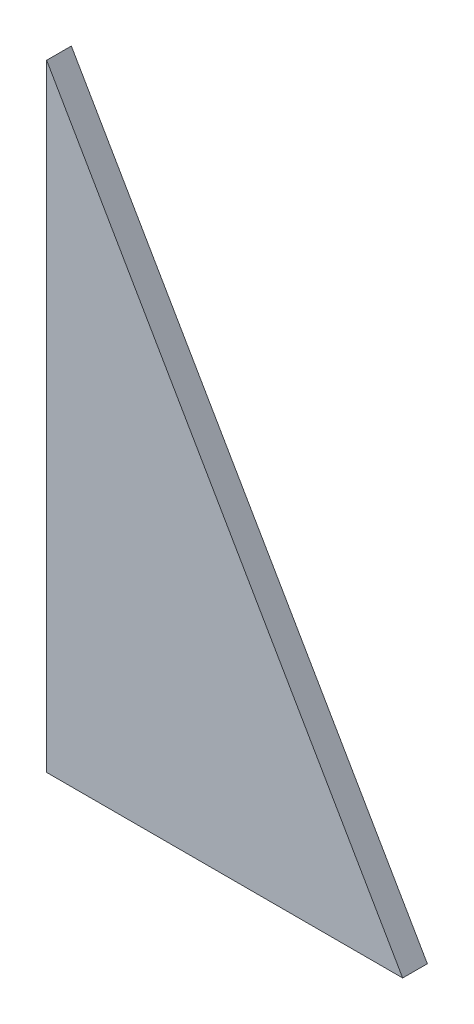
ISO-10303-21;
HEADER;
FILE_DESCRIPTION(('STEP AP214'),'2;1');
FILE_NAME('part.step','',(''),(''),'','','');
FILE_SCHEMA(('AUTOMOTIVE_DESIGN { 1 0 10303 214 1 1 1 1 }'));
ENDSEC;
DATA;
#1=APPLICATION_CONTEXT('core data for automotive mechanical design processes');
#2=APPLICATION_PROTOCOL_DEFINITION('international standard','automotive_design',2000,#1);
#3=PRODUCT_CONTEXT('',#1,'mechanical');
#4=PRODUCT('Part','Part','',(#3));
#5=PRODUCT_RELATED_PRODUCT_CATEGORY('part','',(#4));
#6=PRODUCT_DEFINITION_FORMATION('','',#4);
#7=PRODUCT_DEFINITION_CONTEXT('part definition',#1,'design');
#8=PRODUCT_DEFINITION('design','',#6,#7);
#9=PRODUCT_DEFINITION_SHAPE('','',#8);
#10=(LENGTH_UNIT() NAMED_UNIT(*) SI_UNIT(.MILLI.,.METRE.));
#11=(NAMED_UNIT(*) PLANE_ANGLE_UNIT() SI_UNIT($,.RADIAN.));
#12=(NAMED_UNIT(*) SI_UNIT($,.STERADIAN.) SOLID_ANGLE_UNIT());
#13=UNCERTAINTY_MEASURE_WITH_UNIT(LENGTH_MEASURE(1.E-05),#10,'distance_accuracy_value','');
#14=(GEOMETRIC_REPRESENTATION_CONTEXT(3) GLOBAL_UNCERTAINTY_ASSIGNED_CONTEXT((#13)) GLOBAL_UNIT_ASSIGNED_CONTEXT((#10,
#11,#12)) REPRESENTATION_CONTEXT('',''));
#15=CARTESIAN_POINT('',(0.,0.,0.));
#16=DIRECTION('',(0.,0.,1.));
#17=DIRECTION('',(1.,0.,0.));
#18=AXIS2_PLACEMENT_3D('',#15,#16,#17);
#19=CARTESIAN_POINT('',(0.,0.,2.54));
#20=DIRECTION('',(1.,0.,0.));
#21=DIRECTION('',(0.,0.,-1.));
#22=AXIS2_PLACEMENT_3D('',#19,#20,#21);
#23=PLANE('',#22);
#24=DIRECTION('',(0.,1.,0.));
#25=VECTOR('',#24,1.);
#26=CARTESIAN_POINT('',(0.,31.75,2.032));
#27=LINE('',#26,#25);
#28=CARTESIAN_POINT('',(0.,28.194,2.032));
#29=VERTEX_POINT('',#28);
#30=CARTESIAN_POINT('',(0.,35.306,2.032));
#31=VERTEX_POINT('',#30);
#32=EDGE_CURVE('E187',#29,#31,#27,.T.);
#33=ORIENTED_EDGE('',*,*,#32,.F.);
#34=DIRECTION('',(0.,0.,-1.));
#35=VECTOR('',#34,1.);
#36=CARTESIAN_POINT('',(0.,28.194,2.032));
#37=LINE('',#36,#35);
#38=CARTESIAN_POINT('',(0.,28.194,0.));
#39=VERTEX_POINT('',#38);
#40=EDGE_CURVE('E195',#29,#39,#37,.T.);
#41=ORIENTED_EDGE('',*,*,#40,.T.);
#42=DIRECTION('',(0.,-1.,0.));
#43=VECTOR('',#42,1.);
#44=CARTESIAN_POINT('',(0.,0.,0.));
#45=LINE('',#44,#43);
#46=CARTESIAN_POINT('',(0.,0.,0.));
#47=VERTEX_POINT('',#46);
#48=EDGE_CURVE('E186',#39,#47,#45,.T.);
#49=ORIENTED_EDGE('',*,*,#48,.T.);
#50=DIRECTION('',(0.,0.,-1.));
#51=VECTOR('',#50,1.);
#52=CARTESIAN_POINT('',(0.,0.,2.54));
#53=LINE('',#52,#51);
#54=CARTESIAN_POINT('',(0.,0.,2.54));
#55=VERTEX_POINT('',#54);
#56=EDGE_CURVE('E220',#55,#47,#53,.T.);
#57=ORIENTED_EDGE('',*,*,#56,.F.);
#58=DIRECTION('',(0.,-1.,0.));
#59=VECTOR('',#58,1.);
#60=CARTESIAN_POINT('',(0.,0.,2.54));
#61=LINE('',#60,#59);
#62=CARTESIAN_POINT('',(0.,63.5,2.54));
#63=VERTEX_POINT('',#62);
#64=EDGE_CURVE('E200',#63,#55,#61,.T.);
#65=ORIENTED_EDGE('',*,*,#64,.F.);
#66=DIRECTION('',(0.,0.,-1.));
#67=VECTOR('',#66,1.);
#68=CARTESIAN_POINT('',(0.,63.5,2.54));
#69=LINE('',#68,#67);
#70=CARTESIAN_POINT('',(0.,63.5,0.));
#71=VERTEX_POINT('',#70);
#72=EDGE_CURVE('E208',#63,#71,#69,.T.);
#73=ORIENTED_EDGE('',*,*,#72,.T.);
#74=CARTESIAN_POINT('',(0.,35.306,0.));
#75=VERTEX_POINT('',#74);
#76=EDGE_CURVE('E209',#71,#75,#45,.T.);
#77=ORIENTED_EDGE('',*,*,#76,.T.);
#78=DIRECTION('',(0.,0.,-1.));
#79=VECTOR('',#78,1.);
#80=CARTESIAN_POINT('',(0.,35.306,2.032));
#81=LINE('',#80,#79);
#82=EDGE_CURVE('E197',#31,#75,#81,.T.);
#83=ORIENTED_EDGE('',*,*,#82,.F.);
#84=EDGE_LOOP('',(#33,#41,#49,#57,#65,#73,#77,#83));
#85=FACE_BOUND('',#84,.T.);
#86=ADVANCED_FACE('F31',(#85),#23,.F.);
#87=CARTESIAN_POINT('',(0.,0.,2.54));
#88=DIRECTION('',(0.,1.,0.));
#89=DIRECTION('',(0.,0.,1.));
#90=AXIS2_PLACEMENT_3D('',#87,#88,#89);
#91=PLANE('',#90);
#92=DIRECTION('',(1.,0.,0.));
#93=VECTOR('',#92,1.);
#94=CARTESIAN_POINT('',(0.,0.,0.));
#95=LINE('',#94,#93);
#96=CARTESIAN_POINT('',(36.6522,0.,0.));
#97=VERTEX_POINT('',#96);
#98=EDGE_CURVE('E212',#47,#97,#95,.T.);
#99=ORIENTED_EDGE('',*,*,#98,.T.);
#100=DIRECTION('',(0.,0.,-1.));
#101=VECTOR('',#100,1.);
#102=CARTESIAN_POINT('',(36.6522,0.,2.54));
#103=LINE('',#102,#101);
#104=CARTESIAN_POINT('',(36.6522,0.,2.54));
#105=VERTEX_POINT('',#104);
#106=EDGE_CURVE('E217',#105,#97,#103,.T.);
#107=ORIENTED_EDGE('',*,*,#106,.F.);
#108=DIRECTION('',(1.,0.,0.));
#109=VECTOR('',#108,1.);
#110=CARTESIAN_POINT('',(0.,0.,2.54));
#111=LINE('',#110,#109);
#112=EDGE_CURVE('E203',#55,#105,#111,.T.);
#113=ORIENTED_EDGE('',*,*,#112,.F.);
#114=ORIENTED_EDGE('',*,*,#56,.T.);
#115=EDGE_LOOP('',(#99,#107,#113,#114));
#116=FACE_BOUND('',#115,.T.);
#117=ADVANCED_FACE('F361',(#116),#91,.F.);
#118=CARTESIAN_POINT('',(0.,63.5,2.54));
#119=DIRECTION('',(-0.866081752896378,-0.49990238777179,0.));
#120=DIRECTION('',(0.49990238777179,-0.866081752896378,0.));
#121=AXIS2_PLACEMENT_3D('',#118,#119,#120);
#122=PLANE('',#121);
#123=DIRECTION('',(-0.49990238777179,0.866081752896378,0.));
#124=VECTOR('',#123,1.);
#125=CARTESIAN_POINT('',(0.,63.5,0.));
#126=LINE('',#125,#124);
#127=EDGE_CURVE('E204',#97,#71,#126,.T.);
#128=ORIENTED_EDGE('',*,*,#127,.T.);
#129=ORIENTED_EDGE('',*,*,#72,.F.);
#130=DIRECTION('',(-0.49990238777179,0.866081752896378,0.));
#131=VECTOR('',#130,1.);
#132=CARTESIAN_POINT('',(0.,63.5,2.54));
#133=LINE('',#132,#131);
#134=EDGE_CURVE('E206',#105,#63,#133,.T.);
#135=ORIENTED_EDGE('',*,*,#134,.F.);
#136=ORIENTED_EDGE('',*,*,#106,.T.);
#137=EDGE_LOOP('',(#128,#129,#135,#136));
#138=FACE_BOUND('',#137,.T.);
#139=ADVANCED_FACE('F365',(#138),#122,.F.);
#140=CARTESIAN_POINT('',(0.,0.,2.54));
#141=DIRECTION('',(0.,0.,-1.));
#142=DIRECTION('',(-1.,0.,0.));
#143=AXIS2_PLACEMENT_3D('',#140,#141,#142);
#144=PLANE('',#143);
#145=ORIENTED_EDGE('',*,*,#64,.T.);
#146=ORIENTED_EDGE('',*,*,#112,.T.);
#147=ORIENTED_EDGE('',*,*,#134,.T.);
#148=EDGE_LOOP('',(#145,#146,#147));
#149=FACE_BOUND('',#148,.T.);
#150=ADVANCED_FACE('F371',(#149),#144,.F.);
#151=CARTESIAN_POINT('',(0.,0.,0.));
#152=DIRECTION('',(0.,0.,-1.));
#153=DIRECTION('',(-1.,0.,0.));
#154=AXIS2_PLACEMENT_3D('',#151,#152,#153);
#155=PLANE('',#154);
#156=DIRECTION('',(0.,1.,0.));
#157=VECTOR('',#156,1.);
#158=CARTESIAN_POINT('',(2.54,31.75,0.));
#159=LINE('',#158,#157);
#160=CARTESIAN_POINT('',(2.54,22.5425,0.));
#161=VERTEX_POINT('',#160);
#162=CARTESIAN_POINT('',(2.54,28.194,0.));
#163=VERTEX_POINT('',#162);
#164=EDGE_CURVE('E160',#161,#163,#159,.T.);
#165=ORIENTED_EDGE('',*,*,#164,.F.);
#166=CARTESIAN_POINT('',(4.1275,22.5425,0.));
#167=DIRECTION('',(0.,0.,-1.));
#168=DIRECTION('',(-1.,0.,0.));
#169=AXIS2_PLACEMENT_3D('',#166,#167,#168);
#170=CIRCLE('',#169,1.5875);
#171=CARTESIAN_POINT('',(4.1275,20.955,0.));
#172=VERTEX_POINT('',#171);
#173=EDGE_CURVE('E268',#161,#172,#170,.F.);
#174=ORIENTED_EDGE('',*,*,#173,.T.);
#175=DIRECTION('',(-1.,0.,0.));
#176=VECTOR('',#175,1.);
#177=CARTESIAN_POINT('',(2.54,20.955,0.));
#178=LINE('',#177,#176);
#179=CARTESIAN_POINT('',(16.5666651598498,20.955,0.));
#180=VERTEX_POINT('',#179);
#181=EDGE_CURVE('E279',#180,#172,#178,.T.);
#182=ORIENTED_EDGE('',*,*,#181,.F.);
#183=CARTESIAN_POINT('',(16.5666651598498,22.5425,0.));
#184=DIRECTION('',(0.,0.,-1.));
#185=DIRECTION('',(-1.,0.,0.));
#186=AXIS2_PLACEMENT_3D('',#183,#184,#185);
#187=CIRCLE('',#186,1.5875);
#188=CARTESIAN_POINT('',(17.9415699425728,23.3360950405877,0.));
#189=VERTEX_POINT('',#188);
#190=EDGE_CURVE('E274',#180,#189,#187,.F.);
#191=ORIENTED_EDGE('',*,*,#190,.T.);
#192=DIRECTION('',(0.49990238777179,-0.866081752896379,0.));
#193=VECTOR('',#192,1.);
#194=CARTESIAN_POINT('',(6.85419,42.545,0.));
#195=LINE('',#194,#193);
#196=CARTESIAN_POINT('',(7.31243194257277,41.7510950405877,0.));
#197=VERTEX_POINT('',#196);
#198=EDGE_CURVE('E277',#197,#189,#195,.T.);
#199=ORIENTED_EDGE('',*,*,#198,.F.);
#200=CARTESIAN_POINT('',(5.93752715984977,40.9575,0.));
#201=DIRECTION('',(0.,0.,-1.));
#202=DIRECTION('',(-1.,0.,0.));
#203=AXIS2_PLACEMENT_3D('',#200,#201,#202);
#204=CIRCLE('',#203,1.5875);
#205=CARTESIAN_POINT('',(5.93752715984977,42.545,0.));
#206=VERTEX_POINT('',#205);
#207=EDGE_CURVE('E39',#197,#206,#204,.F.);
#208=ORIENTED_EDGE('',*,*,#207,.T.);
#209=DIRECTION('',(1.,0.,0.));
#210=VECTOR('',#209,1.);
#211=CARTESIAN_POINT('',(2.54,42.545,0.));
#212=LINE('',#211,#210);
#213=CARTESIAN_POINT('',(4.1275,42.545,0.));
#214=VERTEX_POINT('',#213);
#215=EDGE_CURVE('E288',#214,#206,#212,.T.);
#216=ORIENTED_EDGE('',*,*,#215,.F.);
#217=CARTESIAN_POINT('',(4.1275,40.9575,0.));
#218=DIRECTION('',(0.,0.,-1.));
#219=DIRECTION('',(-1.,0.,0.));
#220=AXIS2_PLACEMENT_3D('',#217,#218,#219);
#221=CIRCLE('',#220,1.5875);
#222=CARTESIAN_POINT('',(2.54,40.9575,0.));
#223=VERTEX_POINT('',#222);
#224=EDGE_CURVE('E11',#214,#223,#221,.F.);
#225=ORIENTED_EDGE('',*,*,#224,.T.);
#226=CARTESIAN_POINT('',(2.54,35.306,0.));
#227=VERTEX_POINT('',#226);
#228=EDGE_CURVE('E169',#227,#223,#159,.T.);
#229=ORIENTED_EDGE('',*,*,#228,.F.);
#230=DIRECTION('',(1.,0.,0.));
#231=VECTOR('',#230,1.);
#232=CARTESIAN_POINT('',(0.,35.306,0.));
#233=LINE('',#232,#231);
#234=EDGE_CURVE('E181',#75,#227,#233,.T.);
#235=ORIENTED_EDGE('',*,*,#234,.F.);
#236=ORIENTED_EDGE('',*,*,#76,.F.);
#237=ORIENTED_EDGE('',*,*,#127,.F.);
#238=ORIENTED_EDGE('',*,*,#98,.F.);
#239=ORIENTED_EDGE('',*,*,#48,.F.);
#240=DIRECTION('',(-1.,0.,0.));
#241=VECTOR('',#240,1.);
#242=CARTESIAN_POINT('',(0.,28.194,0.));
#243=LINE('',#242,#241);
#244=EDGE_CURVE('E175',#163,#39,#243,.T.);
#245=ORIENTED_EDGE('',*,*,#244,.F.);
#246=EDGE_LOOP('',(#165,#174,#182,#191,#199,#208,#216,#225,#229,#235,#236,#237,#238,#239,#245));
#247=FACE_BOUND('',#246,.T.);
#248=ADVANCED_FACE('F184',(#247),#155,.T.);
#249=CARTESIAN_POINT('',(0.,28.194,2.032));
#250=DIRECTION('',(0.,-1.,0.));
#251=DIRECTION('',(0.,0.,-1.));
#252=AXIS2_PLACEMENT_3D('',#249,#250,#251);
#253=PLANE('',#252);
#254=DIRECTION('',(-1.,0.,0.));
#255=VECTOR('',#254,1.);
#256=CARTESIAN_POINT('',(0.,28.194,2.032));
#257=LINE('',#256,#255);
#258=CARTESIAN_POINT('',(9.08049999999999,28.194,2.032));
#259=VERTEX_POINT('',#258);
#260=EDGE_CURVE('E199',#259,#29,#257,.T.);
#261=ORIENTED_EDGE('',*,*,#260,.F.);
#262=DIRECTION('',(0.,0.,-1.));
#263=VECTOR('',#262,1.);
#264=CARTESIAN_POINT('',(9.08049999999999,28.194,0.9144));
#265=LINE('',#264,#263);
#266=CARTESIAN_POINT('',(9.08049999999999,28.194,0.9144));
#267=VERTEX_POINT('',#266);
#268=EDGE_CURVE('E254',#259,#267,#265,.T.);
#269=ORIENTED_EDGE('',*,*,#268,.T.);
#270=DIRECTION('',(-1.,0.,0.));
#271=VECTOR('',#270,1.);
#272=CARTESIAN_POINT('',(0.,28.194,0.9144));
#273=LINE('',#272,#271);
#274=CARTESIAN_POINT('',(2.54,28.194,0.9144));
#275=VERTEX_POINT('',#274);
#276=EDGE_CURVE('E179',#267,#275,#273,.T.);
#277=ORIENTED_EDGE('',*,*,#276,.T.);
#278=DIRECTION('',(0.,0.,-1.));
#279=VECTOR('',#278,1.);
#280=CARTESIAN_POINT('',(2.54,28.194,2.032));
#281=LINE('',#280,#279);
#282=EDGE_CURVE('E164',#275,#163,#281,.T.);
#283=ORIENTED_EDGE('',*,*,#282,.T.);
#284=ORIENTED_EDGE('',*,*,#244,.T.);
#285=ORIENTED_EDGE('',*,*,#40,.F.);
#286=EDGE_LOOP('',(#261,#269,#277,#283,#284,#285));
#287=FACE_BOUND('',#286,.T.);
#288=ADVANCED_FACE('F173',(#287),#253,.F.);
#289=CARTESIAN_POINT('',(10.668,35.306,2.032));
#290=DIRECTION('',(1.,0.,0.));
#291=DIRECTION('',(0.,1.,0.));
#292=AXIS2_PLACEMENT_3D('',#289,#290,#291);
#293=PLANE('',#292);
#294=DIRECTION('',(0.,-1.,0.));
#295=VECTOR('',#294,1.);
#296=CARTESIAN_POINT('',(10.668,35.306,2.032));
#297=LINE('',#296,#295);
#298=CARTESIAN_POINT('',(10.668,33.7185,2.032));
#299=VERTEX_POINT('',#298);
#300=CARTESIAN_POINT('',(10.668,29.7815,2.032));
#301=VERTEX_POINT('',#300);
#302=EDGE_CURVE('E315',#299,#301,#297,.T.);
#303=ORIENTED_EDGE('',*,*,#302,.F.);
#304=DIRECTION('',(0.,0.,-1.));
#305=VECTOR('',#304,1.);
#306=CARTESIAN_POINT('',(10.668,33.7185,0.9144));
#307=LINE('',#306,#305);
#308=CARTESIAN_POINT('',(10.668,33.7185,0.9144));
#309=VERTEX_POINT('',#308);
#310=EDGE_CURVE('E245',#299,#309,#307,.T.);
#311=ORIENTED_EDGE('',*,*,#310,.T.);
#312=DIRECTION('',(0.,-1.,0.));
#313=VECTOR('',#312,1.);
#314=CARTESIAN_POINT('',(10.668,35.306,0.9144));
#315=LINE('',#314,#313);
#316=CARTESIAN_POINT('',(10.668,29.7815,0.9144));
#317=VERTEX_POINT('',#316);
#318=EDGE_CURVE('E302',#309,#317,#315,.T.);
#319=ORIENTED_EDGE('',*,*,#318,.T.);
#320=DIRECTION('',(0.,0.,-1.));
#321=VECTOR('',#320,1.);
#322=CARTESIAN_POINT('',(10.668,29.7815,2.032));
#323=LINE('',#322,#321);
#324=EDGE_CURVE('E243',#317,#301,#323,.F.);
#325=ORIENTED_EDGE('',*,*,#324,.T.);
#326=EDGE_LOOP('',(#303,#311,#319,#325));
#327=FACE_BOUND('',#326,.T.);
#328=ADVANCED_FACE('F380',(#327),#293,.F.);
#329=CARTESIAN_POINT('',(0.,35.306,2.032));
#330=DIRECTION('',(0.,1.,0.));
#331=DIRECTION('',(0.,0.,1.));
#332=AXIS2_PLACEMENT_3D('',#329,#330,#331);
#333=PLANE('',#332);
#334=DIRECTION('',(1.,0.,0.));
#335=VECTOR('',#334,1.);
#336=CARTESIAN_POINT('',(0.,35.306,0.9144));
#337=LINE('',#336,#335);
#338=CARTESIAN_POINT('',(2.54,35.306,0.9144));
#339=VERTEX_POINT('',#338);
#340=CARTESIAN_POINT('',(9.08049999999999,35.306,0.9144));
#341=VERTEX_POINT('',#340);
#342=EDGE_CURVE('E223',#339,#341,#337,.T.);
#343=ORIENTED_EDGE('',*,*,#342,.T.);
#344=DIRECTION('',(0.,0.,-1.));
#345=VECTOR('',#344,1.);
#346=CARTESIAN_POINT('',(9.08049999999999,35.306,2.032));
#347=LINE('',#346,#345);
#348=CARTESIAN_POINT('',(9.08049999999999,35.306,2.032));
#349=VERTEX_POINT('',#348);
#350=EDGE_CURVE('E248',#341,#349,#347,.F.);
#351=ORIENTED_EDGE('',*,*,#350,.T.);
#352=DIRECTION('',(1.,0.,0.));
#353=VECTOR('',#352,1.);
#354=CARTESIAN_POINT('',(0.,35.306,2.032));
#355=LINE('',#354,#353);
#356=EDGE_CURVE('E189',#31,#349,#355,.T.);
#357=ORIENTED_EDGE('',*,*,#356,.F.);
#358=ORIENTED_EDGE('',*,*,#82,.T.);
#359=ORIENTED_EDGE('',*,*,#234,.T.);
#360=DIRECTION('',(0.,0.,1.));
#361=VECTOR('',#360,1.);
#362=CARTESIAN_POINT('',(2.54,35.306,2.032));
#363=LINE('',#362,#361);
#364=EDGE_CURVE('E226',#227,#339,#363,.T.);
#365=ORIENTED_EDGE('',*,*,#364,.T.);
#366=EDGE_LOOP('',(#343,#351,#357,#358,#359,#365));
#367=FACE_BOUND('',#366,.T.);
#368=ADVANCED_FACE('F328',(#367),#333,.F.);
#369=CARTESIAN_POINT('',(0.,28.194,2.032));
#370=DIRECTION('',(0.,0.,1.));
#371=DIRECTION('',(1.,0.,0.));
#372=AXIS2_PLACEMENT_3D('',#369,#370,#371);
#373=PLANE('',#372);
#374=ORIENTED_EDGE('',*,*,#356,.T.);
#375=CARTESIAN_POINT('',(9.08049999999999,33.7185,2.032));
#376=DIRECTION('',(0.,0.,1.));
#377=DIRECTION('',(1.,0.,0.));
#378=AXIS2_PLACEMENT_3D('',#375,#376,#377);
#379=CIRCLE('',#378,1.5875);
#380=EDGE_CURVE('E252',#349,#299,#379,.F.);
#381=ORIENTED_EDGE('',*,*,#380,.T.);
#382=ORIENTED_EDGE('',*,*,#302,.T.);
#383=CARTESIAN_POINT('',(9.08049999999999,29.7815,2.032));
#384=DIRECTION('',(0.,0.,1.));
#385=DIRECTION('',(1.,0.,0.));
#386=AXIS2_PLACEMENT_3D('',#383,#384,#385);
#387=CIRCLE('',#386,1.5875);
#388=EDGE_CURVE('E250',#301,#259,#387,.F.);
#389=ORIENTED_EDGE('',*,*,#388,.T.);
#390=ORIENTED_EDGE('',*,*,#260,.T.);
#391=ORIENTED_EDGE('',*,*,#32,.T.);
#392=EDGE_LOOP('',(#374,#381,#382,#389,#390,#391));
#393=FACE_BOUND('',#392,.T.);
#394=ADVANCED_FACE('F318',(#393),#373,.F.);
#395=CARTESIAN_POINT('',(2.54,31.75,0.9144));
#396=DIRECTION('',(-1.,0.,0.));
#397=DIRECTION('',(0.,-1.,0.));
#398=AXIS2_PLACEMENT_3D('',#395,#396,#397);
#399=PLANE('',#398);
#400=DIRECTION('',(0.,1.,0.));
#401=VECTOR('',#400,1.);
#402=CARTESIAN_POINT('',(2.54,42.545,0.9144));
#403=LINE('',#402,#401);
#404=CARTESIAN_POINT('',(2.54,22.5425,0.9144));
#405=VERTEX_POINT('',#404);
#406=EDGE_CURVE('E344',#405,#275,#403,.T.);
#407=ORIENTED_EDGE('',*,*,#406,.F.);
#408=DIRECTION('',(0.,0.,-1.));
#409=VECTOR('',#408,1.);
#410=CARTESIAN_POINT('',(2.54,22.5425,0.));
#411=LINE('',#410,#409);
#412=EDGE_CURVE('E166',#405,#161,#411,.T.);
#413=ORIENTED_EDGE('',*,*,#412,.T.);
#414=ORIENTED_EDGE('',*,*,#164,.T.);
#415=ORIENTED_EDGE('',*,*,#282,.F.);
#416=EDGE_LOOP('',(#407,#413,#414,#415));
#417=FACE_BOUND('',#416,.T.);
#418=ADVANCED_FACE('F163',(#417),#399,.F.);
#419=ORIENTED_EDGE('',*,*,#228,.T.);
#420=DIRECTION('',(0.,0.,-1.));
#421=VECTOR('',#420,1.);
#422=CARTESIAN_POINT('',(2.54,40.9575,0.9144));
#423=LINE('',#422,#421);
#424=CARTESIAN_POINT('',(2.54,40.9575,0.9144));
#425=VERTEX_POINT('',#424);
#426=EDGE_CURVE('E266',#223,#425,#423,.F.);
#427=ORIENTED_EDGE('',*,*,#426,.T.);
#428=EDGE_CURVE('E168',#339,#425,#403,.T.);
#429=ORIENTED_EDGE('',*,*,#428,.F.);
#430=ORIENTED_EDGE('',*,*,#364,.F.);
#431=EDGE_LOOP('',(#419,#427,#429,#430));
#432=FACE_BOUND('',#431,.T.);
#433=ADVANCED_FACE('F332',(#432),#399,.F.);
#434=CARTESIAN_POINT('',(2.54,20.955,0.9144));
#435=DIRECTION('',(0.,0.,1.));
#436=DIRECTION('',(1.,0.,0.));
#437=AXIS2_PLACEMENT_3D('',#434,#435,#436);
#438=PLANE('',#437);
#439=DIRECTION('',(-1.,0.,0.));
#440=VECTOR('',#439,1.);
#441=CARTESIAN_POINT('',(2.54,20.955,0.9144));
#442=LINE('',#441,#440);
#443=CARTESIAN_POINT('',(16.5666651598498,20.955,0.9144));
#444=VERTEX_POINT('',#443);
#445=CARTESIAN_POINT('',(4.1275,20.955,0.9144));
#446=VERTEX_POINT('',#445);
#447=EDGE_CURVE('E296',#444,#446,#442,.T.);
#448=ORIENTED_EDGE('',*,*,#447,.T.);
#449=CARTESIAN_POINT('',(4.1275,22.5425,0.9144));
#450=DIRECTION('',(0.,0.,1.));
#451=DIRECTION('',(1.,0.,0.));
#452=AXIS2_PLACEMENT_3D('',#449,#450,#451);
#453=CIRCLE('',#452,1.5875);
#454=EDGE_CURVE('E241',#446,#405,#453,.F.);
#455=ORIENTED_EDGE('',*,*,#454,.T.);
#456=ORIENTED_EDGE('',*,*,#406,.T.);
#457=ORIENTED_EDGE('',*,*,#276,.F.);
#458=CARTESIAN_POINT('',(9.08049999999999,29.7815,0.9144));
#459=DIRECTION('',(0.,0.,1.));
#460=DIRECTION('',(1.,0.,0.));
#461=AXIS2_PLACEMENT_3D('',#458,#459,#460);
#462=CIRCLE('',#461,1.5875);
#463=EDGE_CURVE('E272',#267,#317,#462,.T.);
#464=ORIENTED_EDGE('',*,*,#463,.T.);
#465=ORIENTED_EDGE('',*,*,#318,.F.);
#466=CARTESIAN_POINT('',(9.08049999999999,33.7185,0.9144));
#467=DIRECTION('',(0.,0.,1.));
#468=DIRECTION('',(1.,0.,0.));
#469=AXIS2_PLACEMENT_3D('',#466,#467,#468);
#470=CIRCLE('',#469,1.5875);
#471=EDGE_CURVE('E270',#309,#341,#470,.T.);
#472=ORIENTED_EDGE('',*,*,#471,.T.);
#473=ORIENTED_EDGE('',*,*,#342,.F.);
#474=ORIENTED_EDGE('',*,*,#428,.T.);
#475=CARTESIAN_POINT('',(4.1275,40.9575,0.9144));
#476=DIRECTION('',(0.,0.,1.));
#477=DIRECTION('',(1.,0.,0.));
#478=AXIS2_PLACEMENT_3D('',#475,#476,#477);
#479=CIRCLE('',#478,1.5875);
#480=CARTESIAN_POINT('',(4.1275,42.545,0.9144));
#481=VERTEX_POINT('',#480);
#482=EDGE_CURVE('E235',#425,#481,#479,.F.);
#483=ORIENTED_EDGE('',*,*,#482,.T.);
#484=DIRECTION('',(1.,0.,0.));
#485=VECTOR('',#484,1.);
#486=CARTESIAN_POINT('',(2.54,42.545,0.9144));
#487=LINE('',#486,#485);
#488=CARTESIAN_POINT('',(5.93752715984977,42.545,0.9144));
#489=VERTEX_POINT('',#488);
#490=EDGE_CURVE('E306',#481,#489,#487,.T.);
#491=ORIENTED_EDGE('',*,*,#490,.T.);
#492=CARTESIAN_POINT('',(5.93752715984977,40.9575,0.9144));
#493=DIRECTION('',(0.,0.,1.));
#494=DIRECTION('',(1.,0.,0.));
#495=AXIS2_PLACEMENT_3D('',#492,#493,#494);
#496=CIRCLE('',#495,1.5875);
#497=CARTESIAN_POINT('',(7.31243194257277,41.7510950405877,0.9144));
#498=VERTEX_POINT('',#497);
#499=EDGE_CURVE('E237',#489,#498,#496,.F.);
#500=ORIENTED_EDGE('',*,*,#499,.T.);
#501=DIRECTION('',(0.49990238777179,-0.866081752896379,0.));
#502=VECTOR('',#501,1.);
#503=CARTESIAN_POINT('',(6.85419,42.545,0.9144));
#504=LINE('',#503,#502);
#505=CARTESIAN_POINT('',(17.9415699425728,23.3360950405877,0.9144));
#506=VERTEX_POINT('',#505);
#507=EDGE_CURVE('E298',#498,#506,#504,.T.);
#508=ORIENTED_EDGE('',*,*,#507,.T.);
#509=CARTESIAN_POINT('',(16.5666651598498,22.5425,0.9144));
#510=DIRECTION('',(0.,0.,1.));
#511=DIRECTION('',(1.,0.,0.));
#512=AXIS2_PLACEMENT_3D('',#509,#510,#511);
#513=CIRCLE('',#512,1.5875);
#514=EDGE_CURVE('E239',#506,#444,#513,.F.);
#515=ORIENTED_EDGE('',*,*,#514,.T.);
#516=EDGE_LOOP('',(#448,#455,#456,#457,#464,#465,#472,#473,#474,#483,#491,#500,#508,#515));
#517=FACE_BOUND('',#516,.T.);
#518=ADVANCED_FACE('F295',(#517),#438,.F.);
#519=CARTESIAN_POINT('',(2.54,20.955,0.9144));
#520=DIRECTION('',(0.,-1.,0.));
#521=DIRECTION('',(1.,0.,0.));
#522=AXIS2_PLACEMENT_3D('',#519,#520,#521);
#523=PLANE('',#522);
#524=ORIENTED_EDGE('',*,*,#181,.T.);
#525=DIRECTION('',(0.,0.,-1.));
#526=VECTOR('',#525,1.);
#527=CARTESIAN_POINT('',(4.1275,20.955,0.9144));
#528=LINE('',#527,#526);
#529=EDGE_CURVE('E233',#172,#446,#528,.F.);
#530=ORIENTED_EDGE('',*,*,#529,.T.);
#531=ORIENTED_EDGE('',*,*,#447,.F.);
#532=DIRECTION('',(0.,0.,-1.));
#533=VECTOR('',#532,1.);
#534=CARTESIAN_POINT('',(16.5666651598498,20.955,0.));
#535=LINE('',#534,#533);
#536=EDGE_CURVE('E230',#444,#180,#535,.T.);
#537=ORIENTED_EDGE('',*,*,#536,.T.);
#538=EDGE_LOOP('',(#524,#530,#531,#537));
#539=FACE_BOUND('',#538,.T.);
#540=ADVANCED_FACE('F300',(#539),#523,.F.);
#541=CARTESIAN_POINT('',(6.85419,42.545,0.9144));
#542=DIRECTION('',(0.866081752896379,0.49990238777179,0.));
#543=DIRECTION('',(-0.499902387771789,0.866081752896378,0.));
#544=AXIS2_PLACEMENT_3D('',#541,#542,#543);
#545=PLANE('',#544);
#546=ORIENTED_EDGE('',*,*,#198,.T.);
#547=DIRECTION('',(0.,0.,-1.));
#548=VECTOR('',#547,1.);
#549=CARTESIAN_POINT('',(17.9415699425728,23.3360950405877,0.9144));
#550=LINE('',#549,#548);
#551=EDGE_CURVE('E259',#189,#506,#550,.F.);
#552=ORIENTED_EDGE('',*,*,#551,.T.);
#553=ORIENTED_EDGE('',*,*,#507,.F.);
#554=DIRECTION('',(0.,0.,-1.));
#555=VECTOR('',#554,1.);
#556=CARTESIAN_POINT('',(7.31243194257277,41.7510950405877,0.));
#557=LINE('',#556,#555);
#558=EDGE_CURVE('E256',#498,#197,#557,.T.);
#559=ORIENTED_EDGE('',*,*,#558,.T.);
#560=EDGE_LOOP('',(#546,#552,#553,#559));
#561=FACE_BOUND('',#560,.T.);
#562=ADVANCED_FACE('F284',(#561),#545,.F.);
#563=CARTESIAN_POINT('',(2.54,42.545,0.9144));
#564=DIRECTION('',(0.,1.,0.));
#565=DIRECTION('',(0.,0.,1.));
#566=AXIS2_PLACEMENT_3D('',#563,#564,#565);
#567=PLANE('',#566);
#568=ORIENTED_EDGE('',*,*,#215,.T.);
#569=DIRECTION('',(0.,0.,-1.));
#570=VECTOR('',#569,1.);
#571=CARTESIAN_POINT('',(5.93752715984977,42.545,0.9144));
#572=LINE('',#571,#570);
#573=EDGE_CURVE('E264',#206,#489,#572,.F.);
#574=ORIENTED_EDGE('',*,*,#573,.T.);
#575=ORIENTED_EDGE('',*,*,#490,.F.);
#576=DIRECTION('',(0.,0.,-1.));
#577=VECTOR('',#576,1.);
#578=CARTESIAN_POINT('',(4.1275,42.545,0.));
#579=LINE('',#578,#577);
#580=EDGE_CURVE('E261',#481,#214,#579,.T.);
#581=ORIENTED_EDGE('',*,*,#580,.T.);
#582=EDGE_LOOP('',(#568,#574,#575,#581));
#583=FACE_BOUND('',#582,.T.);
#584=ADVANCED_FACE('F342',(#583),#567,.F.);
#585=CARTESIAN_POINT('',(4.1275,22.5425,0.9144));
#586=DIRECTION('',(0.,0.,1.));
#587=DIRECTION('',(1.,0.,0.));
#588=AXIS2_PLACEMENT_3D('',#585,#586,#587);
#589=CYLINDRICAL_SURFACE('',#588,1.5875);
#590=ORIENTED_EDGE('',*,*,#454,.F.);
#591=ORIENTED_EDGE('',*,*,#529,.F.);
#592=ORIENTED_EDGE('',*,*,#173,.F.);
#593=ORIENTED_EDGE('',*,*,#412,.F.);
#594=EDGE_LOOP('',(#590,#591,#592,#593));
#595=FACE_BOUND('',#594,.T.);
#596=ADVANCED_FACE('F347',(#595),#589,.F.);
#597=CARTESIAN_POINT('',(9.08049999999999,33.7185,2.032));
#598=DIRECTION('',(0.,0.,1.));
#599=DIRECTION('',(1.,0.,0.));
#600=AXIS2_PLACEMENT_3D('',#597,#598,#599);
#601=CYLINDRICAL_SURFACE('',#600,1.5875);
#602=ORIENTED_EDGE('',*,*,#380,.F.);
#603=ORIENTED_EDGE('',*,*,#350,.F.);
#604=ORIENTED_EDGE('',*,*,#471,.F.);
#605=ORIENTED_EDGE('',*,*,#310,.F.);
#606=EDGE_LOOP('',(#602,#603,#604,#605));
#607=FACE_BOUND('',#606,.T.);
#608=ADVANCED_FACE('F349',(#607),#601,.F.);
#609=CARTESIAN_POINT('',(9.08049999999999,29.7815,2.032));
#610=DIRECTION('',(0.,0.,1.));
#611=DIRECTION('',(1.,0.,0.));
#612=AXIS2_PLACEMENT_3D('',#609,#610,#611);
#613=CYLINDRICAL_SURFACE('',#612,1.5875);
#614=ORIENTED_EDGE('',*,*,#388,.F.);
#615=ORIENTED_EDGE('',*,*,#324,.F.);
#616=ORIENTED_EDGE('',*,*,#463,.F.);
#617=ORIENTED_EDGE('',*,*,#268,.F.);
#618=EDGE_LOOP('',(#614,#615,#616,#617));
#619=FACE_BOUND('',#618,.T.);
#620=ADVANCED_FACE('F355',(#619),#613,.F.);
#621=CARTESIAN_POINT('',(16.5666651598498,22.5425,0.9144));
#622=DIRECTION('',(0.,0.,1.));
#623=DIRECTION('',(1.,0.,0.));
#624=AXIS2_PLACEMENT_3D('',#621,#622,#623);
#625=CYLINDRICAL_SURFACE('',#624,1.5875);
#626=ORIENTED_EDGE('',*,*,#514,.F.);
#627=ORIENTED_EDGE('',*,*,#551,.F.);
#628=ORIENTED_EDGE('',*,*,#190,.F.);
#629=ORIENTED_EDGE('',*,*,#536,.F.);
#630=EDGE_LOOP('',(#626,#627,#628,#629));
#631=FACE_BOUND('',#630,.T.);
#632=ADVANCED_FACE('F291',(#631),#625,.F.);
#633=CARTESIAN_POINT('',(5.93752715984977,40.9575,0.9144));
#634=DIRECTION('',(0.,0.,1.));
#635=DIRECTION('',(1.,0.,0.));
#636=AXIS2_PLACEMENT_3D('',#633,#634,#635);
#637=CYLINDRICAL_SURFACE('',#636,1.5875);
#638=ORIENTED_EDGE('',*,*,#499,.F.);
#639=ORIENTED_EDGE('',*,*,#573,.F.);
#640=ORIENTED_EDGE('',*,*,#207,.F.);
#641=ORIENTED_EDGE('',*,*,#558,.F.);
#642=EDGE_LOOP('',(#638,#639,#640,#641));
#643=FACE_BOUND('',#642,.T.);
#644=ADVANCED_FACE('F509',(#643),#637,.F.);
#645=CARTESIAN_POINT('',(4.1275,40.9575,0.9144));
#646=DIRECTION('',(0.,0.,1.));
#647=DIRECTION('',(1.,0.,0.));
#648=AXIS2_PLACEMENT_3D('',#645,#646,#647);
#649=CYLINDRICAL_SURFACE('',#648,1.5875);
#650=ORIENTED_EDGE('',*,*,#482,.F.);
#651=ORIENTED_EDGE('',*,*,#426,.F.);
#652=ORIENTED_EDGE('',*,*,#224,.F.);
#653=ORIENTED_EDGE('',*,*,#580,.F.);
#654=EDGE_LOOP('',(#650,#651,#652,#653));
#655=FACE_BOUND('',#654,.T.);
#656=ADVANCED_FACE('F33',(#655),#649,.F.);
#657=CLOSED_SHELL('',(#86,#117,#139,#150,#248,#288,#328,#368,#394,#418,#433,#518,#540,#562,#584,
#596,#608,#620,#632,#644,#656));
#658=MANIFOLD_SOLID_BREP('B2',#657);
#659=ADVANCED_BREP_SHAPE_REPRESENTATION('',(#18,#658),#14);
#660=SHAPE_DEFINITION_REPRESENTATION(#9,#659);
ENDSEC;
END-ISO-10303-21;
